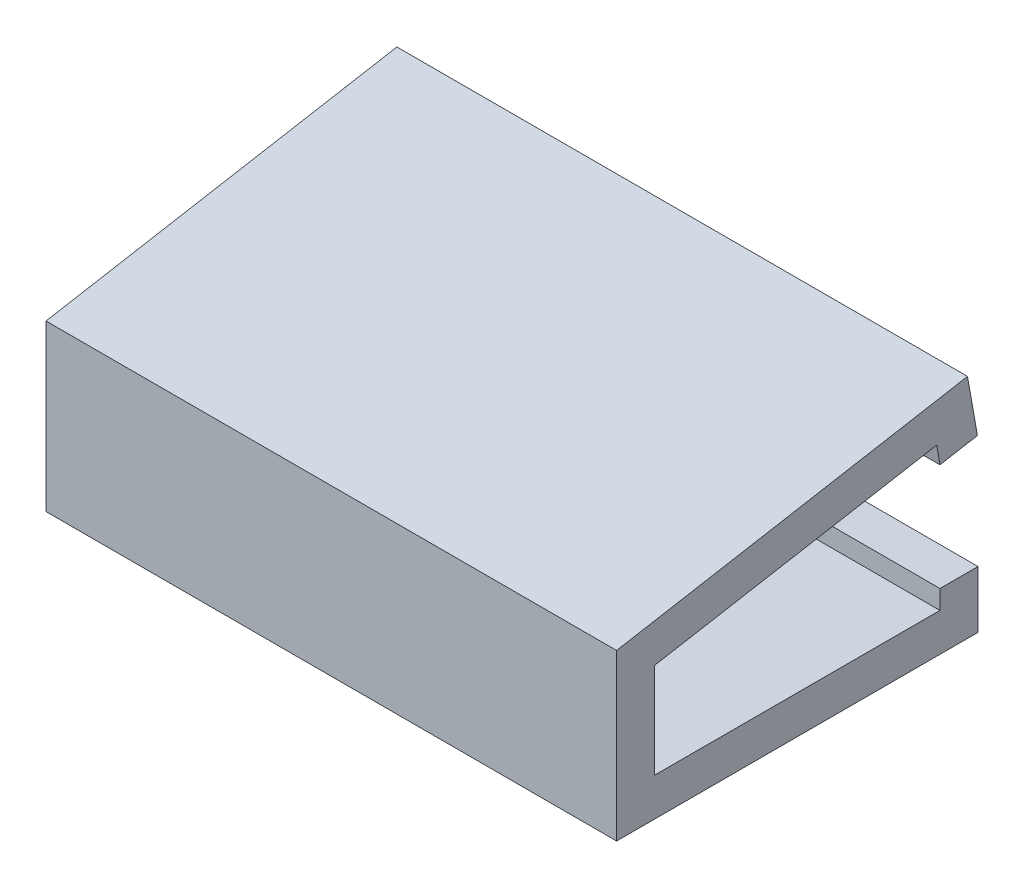
ISO-10303-21;
HEADER;
FILE_DESCRIPTION(('STEP AP214'),'2;1');
FILE_NAME('part.step','',(''),(''),'','','');
FILE_SCHEMA(('AUTOMOTIVE_DESIGN { 1 0 10303 214 1 1 1 1 }'));
ENDSEC;
DATA;
#1=APPLICATION_CONTEXT('core data for automotive mechanical design processes');
#2=APPLICATION_PROTOCOL_DEFINITION('international standard','automotive_design',2000,#1);
#3=PRODUCT_CONTEXT('',#1,'mechanical');
#4=PRODUCT('Part','Part','',(#3));
#5=PRODUCT_RELATED_PRODUCT_CATEGORY('part','',(#4));
#6=PRODUCT_DEFINITION_FORMATION('','',#4);
#7=PRODUCT_DEFINITION_CONTEXT('part definition',#1,'design');
#8=PRODUCT_DEFINITION('design','',#6,#7);
#9=PRODUCT_DEFINITION_SHAPE('','',#8);
#10=(LENGTH_UNIT() NAMED_UNIT(*) SI_UNIT(.MILLI.,.METRE.));
#11=(NAMED_UNIT(*) PLANE_ANGLE_UNIT() SI_UNIT($,.RADIAN.));
#12=(NAMED_UNIT(*) SI_UNIT($,.STERADIAN.) SOLID_ANGLE_UNIT());
#13=UNCERTAINTY_MEASURE_WITH_UNIT(LENGTH_MEASURE(1.E-05),#10,'distance_accuracy_value','');
#14=(GEOMETRIC_REPRESENTATION_CONTEXT(3) GLOBAL_UNCERTAINTY_ASSIGNED_CONTEXT((#13)) GLOBAL_UNIT_ASSIGNED_CONTEXT((#10,
#11,#12)) REPRESENTATION_CONTEXT('',''));
#15=CARTESIAN_POINT('',(0.,0.,0.));
#16=DIRECTION('',(0.,0.,1.));
#17=DIRECTION('',(1.,0.,0.));
#18=AXIS2_PLACEMENT_3D('',#15,#16,#17);
#19=CARTESIAN_POINT('',(150.,-11.6665956255515,-54.0602668147711));
#20=DIRECTION('',(0.,1.,0.));
#21=DIRECTION('',(0.,0.,1.));
#22=AXIS2_PLACEMENT_3D('',#19,#20,#21);
#23=PLANE('',#22);
#24=DIRECTION('',(0.,0.,-1.));
#25=VECTOR('',#24,1.);
#26=CARTESIAN_POINT('',(0.,-11.6665956255515,-54.0602668147711));
#27=LINE('',#26,#25);
#28=CARTESIAN_POINT('',(0.,-11.6665956255515,40.9397331852281));
#29=VERTEX_POINT('',#28);
#30=CARTESIAN_POINT('',(0.,-11.6665956255515,-54.0602668147711));
#31=VERTEX_POINT('',#30);
#32=EDGE_CURVE('E153',#29,#31,#27,.T.);
#33=ORIENTED_EDGE('',*,*,#32,.T.);
#34=DIRECTION('',(-1.,0.,0.));
#35=VECTOR('',#34,1.);
#36=CARTESIAN_POINT('',(150.,-11.6665956255515,-54.0602668147711));
#37=LINE('',#36,#35);
#38=CARTESIAN_POINT('',(150.,-11.6665956255515,-54.0602668147711));
#39=VERTEX_POINT('',#38);
#40=EDGE_CURVE('E11',#39,#31,#37,.T.);
#41=ORIENTED_EDGE('',*,*,#40,.F.);
#42=DIRECTION('',(0.,0.,-1.));
#43=VECTOR('',#42,1.);
#44=CARTESIAN_POINT('',(150.,-11.6665956255515,-54.0602668147711));
#45=LINE('',#44,#43);
#46=CARTESIAN_POINT('',(150.,-11.6665956255515,40.9397331852281));
#47=VERTEX_POINT('',#46);
#48=EDGE_CURVE('E175',#47,#39,#45,.T.);
#49=ORIENTED_EDGE('',*,*,#48,.F.);
#50=DIRECTION('',(-1.,0.,0.));
#51=VECTOR('',#50,1.);
#52=CARTESIAN_POINT('',(150.,-11.6665956255515,40.9397331852281));
#53=LINE('',#52,#51);
#54=EDGE_CURVE('E149',#47,#29,#53,.T.);
#55=ORIENTED_EDGE('',*,*,#54,.T.);
#56=EDGE_LOOP('',(#33,#41,#49,#55));
#57=FACE_BOUND('',#56,.T.);
#58=ADVANCED_FACE('F33',(#57),#23,.F.);
#59=CARTESIAN_POINT('',(150.,3.33340437444832,-54.0602668147712));
#60=DIRECTION('',(0.,0.,1.));
#61=DIRECTION('',(0.,-1.,0.));
#62=AXIS2_PLACEMENT_3D('',#59,#60,#61);
#63=PLANE('',#62);
#64=DIRECTION('',(0.,1.,0.));
#65=VECTOR('',#64,1.);
#66=CARTESIAN_POINT('',(0.,3.33340437444832,-54.0602668147712));
#67=LINE('',#66,#65);
#68=CARTESIAN_POINT('',(0.,3.33340437444832,-54.0602668147712));
#69=VERTEX_POINT('',#68);
#70=EDGE_CURVE('E156',#31,#69,#67,.T.);
#71=ORIENTED_EDGE('',*,*,#70,.T.);
#72=DIRECTION('',(-1.,0.,0.));
#73=VECTOR('',#72,1.);
#74=CARTESIAN_POINT('',(150.,3.33340437444832,-54.0602668147712));
#75=LINE('',#74,#73);
#76=CARTESIAN_POINT('',(150.,3.33340437444832,-54.0602668147712));
#77=VERTEX_POINT('',#76);
#78=EDGE_CURVE('E41',#77,#69,#75,.T.);
#79=ORIENTED_EDGE('',*,*,#78,.F.);
#80=DIRECTION('',(0.,1.,0.));
#81=VECTOR('',#80,1.);
#82=CARTESIAN_POINT('',(150.,3.33340437444832,-54.0602668147712));
#83=LINE('',#82,#81);
#84=EDGE_CURVE('E104',#39,#77,#83,.T.);
#85=ORIENTED_EDGE('',*,*,#84,.F.);
#86=ORIENTED_EDGE('',*,*,#40,.T.);
#87=EDGE_LOOP('',(#71,#79,#85,#86));
#88=FACE_BOUND('',#87,.T.);
#89=ADVANCED_FACE('F253',(#88),#63,.F.);
#90=CARTESIAN_POINT('',(150.,3.33340437444832,-44.0602668147714));
#91=DIRECTION('',(0.,-1.,0.));
#92=DIRECTION('',(0.,0.,-1.));
#93=AXIS2_PLACEMENT_3D('',#90,#91,#92);
#94=PLANE('',#93);
#95=DIRECTION('',(0.,0.,1.));
#96=VECTOR('',#95,1.);
#97=CARTESIAN_POINT('',(0.,3.33340437444832,-44.0602668147714));
#98=LINE('',#97,#96);
#99=CARTESIAN_POINT('',(0.,3.33340437444832,-44.0602668147714));
#100=VERTEX_POINT('',#99);
#101=EDGE_CURVE('E158',#69,#100,#98,.T.);
#102=ORIENTED_EDGE('',*,*,#101,.T.);
#103=DIRECTION('',(-1.,0.,0.));
#104=VECTOR('',#103,1.);
#105=CARTESIAN_POINT('',(150.,3.33340437444832,-44.0602668147714));
#106=LINE('',#105,#104);
#107=CARTESIAN_POINT('',(150.,3.33340437444832,-44.0602668147714));
#108=VERTEX_POINT('',#107);
#109=EDGE_CURVE('E194',#108,#100,#106,.T.);
#110=ORIENTED_EDGE('',*,*,#109,.F.);
#111=DIRECTION('',(0.,0.,1.));
#112=VECTOR('',#111,1.);
#113=CARTESIAN_POINT('',(150.,3.33340437444832,-44.0602668147714));
#114=LINE('',#113,#112);
#115=EDGE_CURVE('E202',#77,#108,#114,.T.);
#116=ORIENTED_EDGE('',*,*,#115,.F.);
#117=ORIENTED_EDGE('',*,*,#78,.T.);
#118=EDGE_LOOP('',(#102,#110,#116,#117));
#119=FACE_BOUND('',#118,.T.);
#120=ADVANCED_FACE('F200',(#119),#94,.F.);
#121=CARTESIAN_POINT('',(150.,-1.66659562555168,-44.0602668147715));
#122=DIRECTION('',(0.,0.,-1.));
#123=DIRECTION('',(0.,1.,0.));
#124=AXIS2_PLACEMENT_3D('',#121,#122,#123);
#125=PLANE('',#124);
#126=DIRECTION('',(0.,-1.,0.));
#127=VECTOR('',#126,1.);
#128=CARTESIAN_POINT('',(0.,-1.66659562555168,-44.0602668147715));
#129=LINE('',#128,#127);
#130=CARTESIAN_POINT('',(0.,-1.66659562555168,-44.0602668147715));
#131=VERTEX_POINT('',#130);
#132=EDGE_CURVE('E160',#100,#131,#129,.T.);
#133=ORIENTED_EDGE('',*,*,#132,.T.);
#134=DIRECTION('',(-1.,0.,0.));
#135=VECTOR('',#134,1.);
#136=CARTESIAN_POINT('',(150.,-1.66659562555168,-44.0602668147715));
#137=LINE('',#136,#135);
#138=CARTESIAN_POINT('',(150.,-1.66659562555168,-44.0602668147715));
#139=VERTEX_POINT('',#138);
#140=EDGE_CURVE('E191',#139,#131,#137,.T.);
#141=ORIENTED_EDGE('',*,*,#140,.F.);
#142=DIRECTION('',(0.,-1.,0.));
#143=VECTOR('',#142,1.);
#144=CARTESIAN_POINT('',(150.,-1.66659562555168,-44.0602668147715));
#145=LINE('',#144,#143);
#146=EDGE_CURVE('E220',#108,#139,#145,.T.);
#147=ORIENTED_EDGE('',*,*,#146,.F.);
#148=ORIENTED_EDGE('',*,*,#109,.T.);
#149=EDGE_LOOP('',(#133,#141,#147,#148));
#150=FACE_BOUND('',#149,.T.);
#151=ADVANCED_FACE('F211',(#150),#125,.F.);
#152=CARTESIAN_POINT('',(150.,-1.6665956255517,30.9397331852284));
#153=DIRECTION('',(0.,-1.,0.));
#154=DIRECTION('',(0.,0.,-1.));
#155=AXIS2_PLACEMENT_3D('',#152,#153,#154);
#156=PLANE('',#155);
#157=DIRECTION('',(0.,0.,1.));
#158=VECTOR('',#157,1.);
#159=CARTESIAN_POINT('',(0.,-1.6665956255517,30.9397331852284));
#160=LINE('',#159,#158);
#161=CARTESIAN_POINT('',(0.,-1.6665956255517,30.9397331852284));
#162=VERTEX_POINT('',#161);
#163=EDGE_CURVE('E162',#131,#162,#160,.T.);
#164=ORIENTED_EDGE('',*,*,#163,.T.);
#165=DIRECTION('',(-1.,0.,0.));
#166=VECTOR('',#165,1.);
#167=CARTESIAN_POINT('',(150.,-1.6665956255517,30.9397331852284));
#168=LINE('',#167,#166);
#169=CARTESIAN_POINT('',(150.,-1.6665956255517,30.9397331852284));
#170=VERTEX_POINT('',#169);
#171=EDGE_CURVE('E188',#170,#162,#168,.T.);
#172=ORIENTED_EDGE('',*,*,#171,.F.);
#173=DIRECTION('',(0.,0.,1.));
#174=VECTOR('',#173,1.);
#175=CARTESIAN_POINT('',(150.,-1.6665956255517,30.9397331852284));
#176=LINE('',#175,#174);
#177=EDGE_CURVE('E217',#139,#170,#176,.T.);
#178=ORIENTED_EDGE('',*,*,#177,.F.);
#179=ORIENTED_EDGE('',*,*,#140,.T.);
#180=EDGE_LOOP('',(#164,#172,#178,#179));
#181=FACE_BOUND('',#180,.T.);
#182=ADVANCED_FACE('F215',(#181),#156,.F.);
#183=CARTESIAN_POINT('',(150.,23.3334043744483,30.9397331852284));
#184=DIRECTION('',(0.,0.,1.));
#185=DIRECTION('',(0.,-1.,0.));
#186=AXIS2_PLACEMENT_3D('',#183,#184,#185);
#187=PLANE('',#186);
#188=DIRECTION('',(0.,1.,0.));
#189=VECTOR('',#188,1.);
#190=CARTESIAN_POINT('',(0.,23.3334043744483,30.9397331852284));
#191=LINE('',#190,#189);
#192=CARTESIAN_POINT('',(0.,23.3334043744483,30.9397331852284));
#193=VERTEX_POINT('',#192);
#194=EDGE_CURVE('E164',#162,#193,#191,.T.);
#195=ORIENTED_EDGE('',*,*,#194,.T.);
#196=DIRECTION('',(-1.,0.,0.));
#197=VECTOR('',#196,1.);
#198=CARTESIAN_POINT('',(150.,23.3334043744483,30.9397331852284));
#199=LINE('',#198,#197);
#200=CARTESIAN_POINT('',(150.,23.3334043744483,30.9397331852284));
#201=VERTEX_POINT('',#200);
#202=EDGE_CURVE('E185',#201,#193,#199,.T.);
#203=ORIENTED_EDGE('',*,*,#202,.F.);
#204=DIRECTION('',(0.,1.,0.));
#205=VECTOR('',#204,1.);
#206=CARTESIAN_POINT('',(150.,23.3334043744483,30.9397331852284));
#207=LINE('',#206,#205);
#208=EDGE_CURVE('E219',#170,#201,#207,.T.);
#209=ORIENTED_EDGE('',*,*,#208,.F.);
#210=ORIENTED_EDGE('',*,*,#171,.T.);
#211=EDGE_LOOP('',(#195,#203,#209,#210));
#212=FACE_BOUND('',#211,.T.);
#213=ADVANCED_FACE('F266',(#212),#187,.F.);
#214=CARTESIAN_POINT('',(150.,36.4048336332149,-43.1920259264367));
#215=DIRECTION('',(0.,0.984807753012209,0.173648177666924));
#216=DIRECTION('',(0.,-0.173648177666924,0.984807753012209));
#217=AXIS2_PLACEMENT_3D('',#214,#215,#216);
#218=PLANE('',#217);
#219=DIRECTION('',(0.,0.173648177666924,-0.984807753012209));
#220=VECTOR('',#219,1.);
#221=CARTESIAN_POINT('',(0.,36.4048336332149,-43.1920259264367));
#222=LINE('',#221,#220);
#223=CARTESIAN_POINT('',(0.,36.4048336332149,-43.1920259264367));
#224=VERTEX_POINT('',#223);
#225=EDGE_CURVE('E166',#193,#224,#222,.T.);
#226=ORIENTED_EDGE('',*,*,#225,.T.);
#227=DIRECTION('',(-1.,0.,0.));
#228=VECTOR('',#227,1.);
#229=CARTESIAN_POINT('',(150.,36.4048336332149,-43.1920259264367));
#230=LINE('',#229,#228);
#231=CARTESIAN_POINT('',(150.,36.4048336332149,-43.1920259264367));
#232=VERTEX_POINT('',#231);
#233=EDGE_CURVE('E182',#232,#224,#230,.T.);
#234=ORIENTED_EDGE('',*,*,#233,.F.);
#235=DIRECTION('',(0.,0.173648177666924,-0.984807753012209));
#236=VECTOR('',#235,1.);
#237=CARTESIAN_POINT('',(150.,36.4048336332149,-43.1920259264367));
#238=LINE('',#237,#236);
#239=EDGE_CURVE('E222',#201,#232,#238,.T.);
#240=ORIENTED_EDGE('',*,*,#239,.F.);
#241=ORIENTED_EDGE('',*,*,#202,.T.);
#242=EDGE_LOOP('',(#226,#234,#240,#241));
#243=FACE_BOUND('',#242,.T.);
#244=ADVANCED_FACE('F269',(#243),#218,.F.);
#245=CARTESIAN_POINT('',(150.,31.4807948681539,-44.0602668147714));
#246=DIRECTION('',(0.,0.173648177666935,-0.984807753012207));
#247=DIRECTION('',(0.,0.984807753012207,0.173648177666935));
#248=AXIS2_PLACEMENT_3D('',#245,#246,#247);
#249=PLANE('',#248);
#250=DIRECTION('',(0.,-0.984807753012207,-0.173648177666935));
#251=VECTOR('',#250,1.);
#252=CARTESIAN_POINT('',(0.,31.4807948681539,-44.0602668147714));
#253=LINE('',#252,#251);
#254=CARTESIAN_POINT('',(0.,31.4807948681539,-44.0602668147714));
#255=VERTEX_POINT('',#254);
#256=EDGE_CURVE('E168',#224,#255,#253,.T.);
#257=ORIENTED_EDGE('',*,*,#256,.T.);
#258=DIRECTION('',(-1.,0.,0.));
#259=VECTOR('',#258,1.);
#260=CARTESIAN_POINT('',(150.,31.4807948681539,-44.0602668147714));
#261=LINE('',#260,#259);
#262=CARTESIAN_POINT('',(150.,31.4807948681539,-44.0602668147714));
#263=VERTEX_POINT('',#262);
#264=EDGE_CURVE('E179',#263,#255,#261,.T.);
#265=ORIENTED_EDGE('',*,*,#264,.F.);
#266=DIRECTION('',(0.,-0.984807753012207,-0.173648177666935));
#267=VECTOR('',#266,1.);
#268=CARTESIAN_POINT('',(150.,31.4807948681539,-44.0602668147714));
#269=LINE('',#268,#267);
#270=EDGE_CURVE('E228',#232,#263,#269,.T.);
#271=ORIENTED_EDGE('',*,*,#270,.F.);
#272=ORIENTED_EDGE('',*,*,#233,.T.);
#273=EDGE_LOOP('',(#257,#265,#271,#272));
#274=FACE_BOUND('',#273,.T.);
#275=ADVANCED_FACE('F234',(#274),#249,.F.);
#276=CARTESIAN_POINT('',(150.,33.217276644823,-53.9083443448933));
#277=DIRECTION('',(0.,0.98480775301221,0.173648177666917));
#278=DIRECTION('',(0.,-0.173648177666917,0.984807753012211));
#279=AXIS2_PLACEMENT_3D('',#276,#277,#278);
#280=PLANE('',#279);
#281=DIRECTION('',(0.,0.173648177666917,-0.98480775301221));
#282=VECTOR('',#281,1.);
#283=CARTESIAN_POINT('',(0.,33.217276644823,-53.9083443448933));
#284=LINE('',#283,#282);
#285=CARTESIAN_POINT('',(0.,33.217276644823,-53.9083443448933));
#286=VERTEX_POINT('',#285);
#287=EDGE_CURVE('E170',#255,#286,#284,.T.);
#288=ORIENTED_EDGE('',*,*,#287,.T.);
#289=DIRECTION('',(-1.,0.,0.));
#290=VECTOR('',#289,1.);
#291=CARTESIAN_POINT('',(150.,33.217276644823,-53.9083443448933));
#292=LINE('',#291,#290);
#293=CARTESIAN_POINT('',(150.,33.217276644823,-53.9083443448933));
#294=VERTEX_POINT('',#293);
#295=EDGE_CURVE('E144',#294,#286,#292,.T.);
#296=ORIENTED_EDGE('',*,*,#295,.F.);
#297=DIRECTION('',(0.,0.173648177666917,-0.98480775301221));
#298=VECTOR('',#297,1.);
#299=CARTESIAN_POINT('',(150.,33.217276644823,-53.9083443448933));
#300=LINE('',#299,#298);
#301=EDGE_CURVE('E135',#263,#294,#300,.T.);
#302=ORIENTED_EDGE('',*,*,#301,.F.);
#303=ORIENTED_EDGE('',*,*,#264,.T.);
#304=EDGE_LOOP('',(#288,#296,#302,#303));
#305=FACE_BOUND('',#304,.T.);
#306=ADVANCED_FACE('F238',(#305),#280,.F.);
#307=CARTESIAN_POINT('',(150.,47.989392940006,-51.3036216798895));
#308=DIRECTION('',(0.,-0.17364817766692,0.98480775301221));
#309=DIRECTION('',(0.,-0.98480775301221,-0.17364817766692));
#310=AXIS2_PLACEMENT_3D('',#307,#308,#309);
#311=PLANE('',#310);
#312=DIRECTION('',(0.,0.98480775301221,0.17364817766692));
#313=VECTOR('',#312,1.);
#314=CARTESIAN_POINT('',(0.,47.989392940006,-51.3036216798895));
#315=LINE('',#314,#313);
#316=CARTESIAN_POINT('',(0.,47.989392940006,-51.3036216798895));
#317=VERTEX_POINT('',#316);
#318=EDGE_CURVE('E143',#286,#317,#315,.T.);
#319=ORIENTED_EDGE('',*,*,#318,.T.);
#320=DIRECTION('',(-1.,0.,0.));
#321=VECTOR('',#320,1.);
#322=CARTESIAN_POINT('',(150.,47.989392940006,-51.3036216798895));
#323=LINE('',#322,#321);
#324=CARTESIAN_POINT('',(150.,47.989392940006,-51.3036216798895));
#325=VERTEX_POINT('',#324);
#326=EDGE_CURVE('E140',#325,#317,#323,.T.);
#327=ORIENTED_EDGE('',*,*,#326,.F.);
#328=DIRECTION('',(0.,0.98480775301221,0.17364817766692));
#329=VECTOR('',#328,1.);
#330=CARTESIAN_POINT('',(150.,47.989392940006,-51.3036216798895));
#331=LINE('',#330,#329);
#332=EDGE_CURVE('E129',#294,#325,#331,.T.);
#333=ORIENTED_EDGE('',*,*,#332,.F.);
#334=ORIENTED_EDGE('',*,*,#295,.T.);
#335=EDGE_LOOP('',(#319,#327,#333,#334));
#336=FACE_BOUND('',#335,.T.);
#337=ADVANCED_FACE('F141',(#336),#311,.F.);
#338=CARTESIAN_POINT('',(150.,31.724400686221,40.9397331852281));
#339=DIRECTION('',(0.,-0.984807753012209,-0.173648177666923));
#340=DIRECTION('',(0.,0.173648177666923,-0.984807753012209));
#341=AXIS2_PLACEMENT_3D('',#338,#339,#340);
#342=PLANE('',#341);
#343=DIRECTION('',(0.,-0.173648177666923,0.984807753012209));
#344=VECTOR('',#343,1.);
#345=CARTESIAN_POINT('',(0.,31.724400686221,40.9397331852281));
#346=LINE('',#345,#344);
#347=CARTESIAN_POINT('',(0.,31.724400686221,40.9397331852281));
#348=VERTEX_POINT('',#347);
#349=EDGE_CURVE('E90',#317,#348,#346,.T.);
#350=ORIENTED_EDGE('',*,*,#349,.T.);
#351=DIRECTION('',(-1.,0.,0.));
#352=VECTOR('',#351,1.);
#353=CARTESIAN_POINT('',(150.,31.724400686221,40.9397331852281));
#354=LINE('',#353,#352);
#355=CARTESIAN_POINT('',(150.,31.724400686221,40.9397331852281));
#356=VERTEX_POINT('',#355);
#357=EDGE_CURVE('E145',#356,#348,#354,.T.);
#358=ORIENTED_EDGE('',*,*,#357,.F.);
#359=DIRECTION('',(0.,-0.173648177666923,0.984807753012209));
#360=VECTOR('',#359,1.);
#361=CARTESIAN_POINT('',(150.,31.724400686221,40.9397331852281));
#362=LINE('',#361,#360);
#363=EDGE_CURVE('E133',#325,#356,#362,.T.);
#364=ORIENTED_EDGE('',*,*,#363,.F.);
#365=ORIENTED_EDGE('',*,*,#326,.T.);
#366=EDGE_LOOP('',(#350,#358,#364,#365));
#367=FACE_BOUND('',#366,.T.);
#368=ADVANCED_FACE('F147',(#367),#342,.F.);
#369=CARTESIAN_POINT('',(150.,-11.6665956255515,40.9397331852281));
#370=DIRECTION('',(0.,0.,-1.));
#371=DIRECTION('',(0.,1.,0.));
#372=AXIS2_PLACEMENT_3D('',#369,#370,#371);
#373=PLANE('',#372);
#374=DIRECTION('',(0.,-1.,0.));
#375=VECTOR('',#374,1.);
#376=CARTESIAN_POINT('',(0.,-11.6665956255515,40.9397331852281));
#377=LINE('',#376,#375);
#378=EDGE_CURVE('E96',#348,#29,#377,.T.);
#379=ORIENTED_EDGE('',*,*,#378,.T.);
#380=ORIENTED_EDGE('',*,*,#54,.F.);
#381=DIRECTION('',(0.,-1.,0.));
#382=VECTOR('',#381,1.);
#383=CARTESIAN_POINT('',(150.,-11.6665956255515,40.9397331852281));
#384=LINE('',#383,#382);
#385=EDGE_CURVE('E49',#356,#47,#384,.T.);
#386=ORIENTED_EDGE('',*,*,#385,.F.);
#387=ORIENTED_EDGE('',*,*,#357,.T.);
#388=EDGE_LOOP('',(#379,#380,#386,#387));
#389=FACE_BOUND('',#388,.T.);
#390=ADVANCED_FACE('F242',(#389),#373,.F.);
#391=CARTESIAN_POINT('',(150.,0.,0.));
#392=DIRECTION('',(-1.,0.,0.));
#393=DIRECTION('',(0.,0.,1.));
#394=AXIS2_PLACEMENT_3D('',#391,#392,#393);
#395=PLANE('',#394);
#396=ORIENTED_EDGE('',*,*,#48,.T.);
#397=ORIENTED_EDGE('',*,*,#84,.T.);
#398=ORIENTED_EDGE('',*,*,#115,.T.);
#399=ORIENTED_EDGE('',*,*,#146,.T.);
#400=ORIENTED_EDGE('',*,*,#177,.T.);
#401=ORIENTED_EDGE('',*,*,#208,.T.);
#402=ORIENTED_EDGE('',*,*,#239,.T.);
#403=ORIENTED_EDGE('',*,*,#270,.T.);
#404=ORIENTED_EDGE('',*,*,#301,.T.);
#405=ORIENTED_EDGE('',*,*,#332,.T.);
#406=ORIENTED_EDGE('',*,*,#363,.T.);
#407=ORIENTED_EDGE('',*,*,#385,.T.);
#408=EDGE_LOOP('',(#396,#397,#398,#399,#400,#401,#402,#403,#404,#405,#406,#407));
#409=FACE_BOUND('',#408,.T.);
#410=ADVANCED_FACE('F131',(#409),#395,.F.);
#411=CARTESIAN_POINT('',(0.,0.,0.));
#412=DIRECTION('',(-1.,0.,0.));
#413=DIRECTION('',(0.,0.,1.));
#414=AXIS2_PLACEMENT_3D('',#411,#412,#413);
#415=PLANE('',#414);
#416=ORIENTED_EDGE('',*,*,#32,.F.);
#417=ORIENTED_EDGE('',*,*,#378,.F.);
#418=ORIENTED_EDGE('',*,*,#349,.F.);
#419=ORIENTED_EDGE('',*,*,#318,.F.);
#420=ORIENTED_EDGE('',*,*,#287,.F.);
#421=ORIENTED_EDGE('',*,*,#256,.F.);
#422=ORIENTED_EDGE('',*,*,#225,.F.);
#423=ORIENTED_EDGE('',*,*,#194,.F.);
#424=ORIENTED_EDGE('',*,*,#163,.F.);
#425=ORIENTED_EDGE('',*,*,#132,.F.);
#426=ORIENTED_EDGE('',*,*,#101,.F.);
#427=ORIENTED_EDGE('',*,*,#70,.F.);
#428=EDGE_LOOP('',(#416,#417,#418,#419,#420,#421,#422,#423,#424,#425,#426,#427));
#429=FACE_BOUND('',#428,.T.);
#430=ADVANCED_FACE('F206',(#429),#415,.T.);
#431=CLOSED_SHELL('',(#58,#89,#120,#151,#182,#213,#244,#275,#306,#337,#368,#390,#410,#430));
#432=MANIFOLD_SOLID_BREP('B2',#431);
#433=ADVANCED_BREP_SHAPE_REPRESENTATION('',(#18,#432),#14);
#434=SHAPE_DEFINITION_REPRESENTATION(#9,#433);
ENDSEC;
END-ISO-10303-21;
